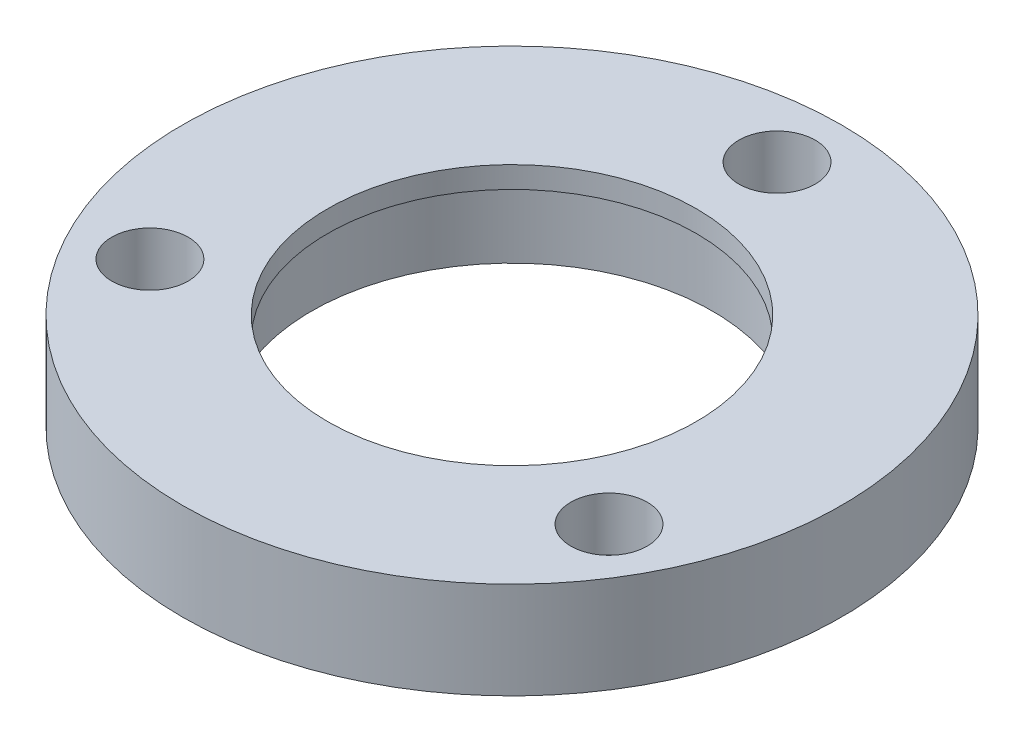
ISO-10303-21;
HEADER;
FILE_DESCRIPTION(('STEP AP214'),'2;1');
FILE_NAME('part.step','',(''),(''),'','','');
FILE_SCHEMA(('AUTOMOTIVE_DESIGN { 1 0 10303 214 1 1 1 1 }'));
ENDSEC;
DATA;
#1=APPLICATION_CONTEXT('core data for automotive mechanical design processes');
#2=APPLICATION_PROTOCOL_DEFINITION('international standard','automotive_design',2000,#1);
#3=PRODUCT_CONTEXT('',#1,'mechanical');
#4=PRODUCT('Part','Part','',(#3));
#5=PRODUCT_RELATED_PRODUCT_CATEGORY('part','',(#4));
#6=PRODUCT_DEFINITION_FORMATION('','',#4);
#7=PRODUCT_DEFINITION_CONTEXT('part definition',#1,'design');
#8=PRODUCT_DEFINITION('design','',#6,#7);
#9=PRODUCT_DEFINITION_SHAPE('','',#8);
#10=(LENGTH_UNIT() NAMED_UNIT(*) SI_UNIT(.MILLI.,.METRE.));
#11=(NAMED_UNIT(*) PLANE_ANGLE_UNIT() SI_UNIT($,.RADIAN.));
#12=(NAMED_UNIT(*) SI_UNIT($,.STERADIAN.) SOLID_ANGLE_UNIT());
#13=UNCERTAINTY_MEASURE_WITH_UNIT(LENGTH_MEASURE(1.E-05),#10,'distance_accuracy_value','');
#14=(GEOMETRIC_REPRESENTATION_CONTEXT(3) GLOBAL_UNCERTAINTY_ASSIGNED_CONTEXT((#13)) GLOBAL_UNIT_ASSIGNED_CONTEXT((#10,
#11,#12)) REPRESENTATION_CONTEXT('',''));
#15=CARTESIAN_POINT('',(0.,0.,0.));
#16=DIRECTION('',(0.,0.,1.));
#17=DIRECTION('',(1.,0.,0.));
#18=AXIS2_PLACEMENT_3D('',#15,#16,#17);
#19=CARTESIAN_POINT('',(21.3475262032864,0.,12.325));
#20=DIRECTION('',(0.,1.,0.));
#21=DIRECTION('',(0.,0.,1.));
#22=AXIS2_PLACEMENT_3D('',#19,#20,#21);
#23=CYLINDRICAL_SURFACE('',#22,2.25000000000012);
#24=CARTESIAN_POINT('',(21.3475262032864,0.,12.325));
#25=DIRECTION('',(0.,1.,0.));
#26=DIRECTION('',(0.,0.,1.));
#27=AXIS2_PLACEMENT_3D('',#24,#25,#26);
#28=CIRCLE('',#27,2.25000000000012);
#29=CARTESIAN_POINT('',(21.3475262032864,0.,14.5750000000001));
#30=VERTEX_POINT('',#29);
#31=EDGE_CURVE('E59',#30,#30,#28,.T.);
#32=ORIENTED_EDGE('',*,*,#31,.F.);
#33=EDGE_LOOP('',(#32));
#34=FACE_BOUND('',#33,.T.);
#35=CARTESIAN_POINT('',(21.3475262032864,4.,12.325));
#36=DIRECTION('',(0.,1.,0.));
#37=DIRECTION('',(0.,0.,1.));
#38=AXIS2_PLACEMENT_3D('',#35,#36,#37);
#39=CIRCLE('',#38,2.25000000000012);
#40=CARTESIAN_POINT('',(21.3475262032864,4.,14.5750000000001));
#41=VERTEX_POINT('',#40);
#42=EDGE_CURVE('E80',#41,#41,#39,.T.);
#43=ORIENTED_EDGE('',*,*,#42,.T.);
#44=EDGE_LOOP('',(#43));
#45=FACE_BOUND('',#44,.T.);
#46=ADVANCED_FACE('F32',(#34,#45),#23,.F.);
#47=CARTESIAN_POINT('',(-21.3475262032864,0.,12.325));
#48=DIRECTION('',(0.,1.,0.));
#49=DIRECTION('',(0.,0.,1.));
#50=AXIS2_PLACEMENT_3D('',#47,#48,#49);
#51=CYLINDRICAL_SURFACE('',#50,2.25000000000024);
#52=CARTESIAN_POINT('',(-21.3475262032864,0.,12.325));
#53=DIRECTION('',(0.,1.,0.));
#54=DIRECTION('',(0.,0.,1.));
#55=AXIS2_PLACEMENT_3D('',#52,#53,#54);
#56=CIRCLE('',#55,2.25000000000024);
#57=CARTESIAN_POINT('',(-21.3475262032864,0.,14.5750000000003));
#58=VERTEX_POINT('',#57);
#59=EDGE_CURVE('E62',#58,#58,#56,.T.);
#60=ORIENTED_EDGE('',*,*,#59,.F.);
#61=EDGE_LOOP('',(#60));
#62=FACE_BOUND('',#61,.T.);
#63=CARTESIAN_POINT('',(-21.3475262032864,4.,12.325));
#64=DIRECTION('',(0.,1.,0.));
#65=DIRECTION('',(0.,0.,1.));
#66=AXIS2_PLACEMENT_3D('',#63,#64,#65);
#67=CIRCLE('',#66,2.25000000000024);
#68=CARTESIAN_POINT('',(-21.3475262032864,4.,14.5750000000003));
#69=VERTEX_POINT('',#68);
#70=EDGE_CURVE('E71',#69,#69,#67,.T.);
#71=ORIENTED_EDGE('',*,*,#70,.T.);
#72=EDGE_LOOP('',(#71));
#73=FACE_BOUND('',#72,.T.);
#74=ADVANCED_FACE('F130',(#62,#73),#51,.F.);
#75=CARTESIAN_POINT('',(0.,0.,-24.65));
#76=DIRECTION('',(0.,1.,0.));
#77=DIRECTION('',(0.,0.,1.));
#78=AXIS2_PLACEMENT_3D('',#75,#76,#77);
#79=CYLINDRICAL_SURFACE('',#78,2.25);
#80=CARTESIAN_POINT('',(0.,0.,-24.65));
#81=DIRECTION('',(0.,1.,0.));
#82=DIRECTION('',(0.,0.,1.));
#83=AXIS2_PLACEMENT_3D('',#80,#81,#82);
#84=CIRCLE('',#83,2.25);
#85=CARTESIAN_POINT('',(0.,0.,-22.4));
#86=VERTEX_POINT('',#85);
#87=EDGE_CURVE('E58',#86,#86,#84,.T.);
#88=ORIENTED_EDGE('',*,*,#87,.F.);
#89=EDGE_LOOP('',(#88));
#90=FACE_BOUND('',#89,.T.);
#91=CARTESIAN_POINT('',(0.,4.,-24.65));
#92=DIRECTION('',(0.,1.,0.));
#93=DIRECTION('',(0.,0.,1.));
#94=AXIS2_PLACEMENT_3D('',#91,#92,#93);
#95=CIRCLE('',#94,2.25);
#96=CARTESIAN_POINT('',(0.,4.,-22.4));
#97=VERTEX_POINT('',#96);
#98=EDGE_CURVE('E63',#97,#97,#95,.T.);
#99=ORIENTED_EDGE('',*,*,#98,.T.);
#100=EDGE_LOOP('',(#99));
#101=FACE_BOUND('',#100,.T.);
#102=ADVANCED_FACE('F136',(#90,#101),#79,.F.);
#103=CARTESIAN_POINT('',(0.,23.6626482213439,0.));
#104=DIRECTION('',(0.,1.,0.));
#105=DIRECTION('',(0.,0.,1.));
#106=AXIS2_PLACEMENT_3D('',#103,#104,#105);
#107=CYLINDRICAL_SURFACE('',#106,17.15);
#108=CARTESIAN_POINT('',(0.,7.,0.));
#109=DIRECTION('',(0.,1.,0.));
#110=DIRECTION('',(0.,0.,1.));
#111=AXIS2_PLACEMENT_3D('',#108,#109,#110);
#112=CIRCLE('',#111,17.15);
#113=CARTESIAN_POINT('',(0.,7.,17.15));
#114=VERTEX_POINT('',#113);
#115=EDGE_CURVE('E55',#114,#114,#112,.T.);
#116=ORIENTED_EDGE('',*,*,#115,.F.);
#117=EDGE_LOOP('',(#116));
#118=FACE_BOUND('',#117,.T.);
#119=CARTESIAN_POINT('',(0.,9.,0.));
#120=DIRECTION('',(0.,1.,0.));
#121=DIRECTION('',(0.,0.,1.));
#122=AXIS2_PLACEMENT_3D('',#119,#120,#121);
#123=CIRCLE('',#122,17.15);
#124=CARTESIAN_POINT('',(0.,9.,17.15));
#125=VERTEX_POINT('',#124);
#126=EDGE_CURVE('E10',#125,#125,#123,.T.);
#127=ORIENTED_EDGE('',*,*,#126,.T.);
#128=EDGE_LOOP('',(#127));
#129=FACE_BOUND('',#128,.T.);
#130=ADVANCED_FACE('F34',(#118,#129),#107,.F.);
#131=CARTESIAN_POINT('',(17.15,9.,0.));
#132=DIRECTION('',(0.,-1.,0.));
#133=DIRECTION('',(0.,0.,-1.));
#134=AXIS2_PLACEMENT_3D('',#131,#132,#133);
#135=PLANE('',#134);
#136=CARTESIAN_POINT('',(0.,9.,-24.65));
#137=DIRECTION('',(0.,1.,0.));
#138=DIRECTION('',(0.,0.,1.));
#139=AXIS2_PLACEMENT_3D('',#136,#137,#138);
#140=CIRCLE('',#139,3.55);
#141=CARTESIAN_POINT('',(0.,9.,-21.1));
#142=VERTEX_POINT('',#141);
#143=EDGE_CURVE('E84',#142,#142,#140,.T.);
#144=ORIENTED_EDGE('',*,*,#143,.F.);
#145=EDGE_LOOP('',(#144));
#146=FACE_BOUND('',#145,.T.);
#147=CARTESIAN_POINT('',(21.3475262032864,9.,12.325));
#148=DIRECTION('',(0.,1.,0.));
#149=DIRECTION('',(0.,0.,1.));
#150=AXIS2_PLACEMENT_3D('',#147,#148,#149);
#151=CIRCLE('',#150,3.55000000000012);
#152=CARTESIAN_POINT('',(21.3475262032864,9.,15.8750000000001));
#153=VERTEX_POINT('',#152);
#154=EDGE_CURVE('E75',#153,#153,#151,.T.);
#155=ORIENTED_EDGE('',*,*,#154,.F.);
#156=EDGE_LOOP('',(#155));
#157=FACE_BOUND('',#156,.T.);
#158=CARTESIAN_POINT('',(-21.3475262032864,9.,12.325));
#159=DIRECTION('',(0.,1.,0.));
#160=DIRECTION('',(0.,0.,1.));
#161=AXIS2_PLACEMENT_3D('',#158,#159,#160);
#162=CIRCLE('',#161,3.55000000000023);
#163=CARTESIAN_POINT('',(-21.3475262032864,9.,15.8750000000003));
#164=VERTEX_POINT('',#163);
#165=EDGE_CURVE('E68',#164,#164,#162,.T.);
#166=ORIENTED_EDGE('',*,*,#165,.F.);
#167=EDGE_LOOP('',(#166));
#168=FACE_BOUND('',#167,.T.);
#169=ORIENTED_EDGE('',*,*,#126,.F.);
#170=EDGE_LOOP('',(#169));
#171=FACE_BOUND('',#170,.T.);
#172=CARTESIAN_POINT('',(0.,9.,0.));
#173=DIRECTION('',(0.,1.,0.));
#174=DIRECTION('',(0.,0.,1.));
#175=AXIS2_PLACEMENT_3D('',#172,#173,#174);
#176=CIRCLE('',#175,30.65);
#177=CARTESIAN_POINT('',(0.,9.,30.65));
#178=VERTEX_POINT('',#177);
#179=EDGE_CURVE('E39',#178,#178,#176,.T.);
#180=ORIENTED_EDGE('',*,*,#179,.T.);
#181=EDGE_LOOP('',(#180));
#182=FACE_BOUND('',#181,.T.);
#183=ADVANCED_FACE('F105',(#146,#157,#168,#171,#182),#135,.F.);
#184=CARTESIAN_POINT('',(0.,23.6626482213439,0.));
#185=DIRECTION('',(0.,1.,0.));
#186=DIRECTION('',(0.,0.,1.));
#187=AXIS2_PLACEMENT_3D('',#184,#185,#186);
#188=CYLINDRICAL_SURFACE('',#187,30.65);
#189=ORIENTED_EDGE('',*,*,#179,.F.);
#190=EDGE_LOOP('',(#189));
#191=FACE_BOUND('',#190,.T.);
#192=CARTESIAN_POINT('',(0.,0.,0.));
#193=DIRECTION('',(0.,1.,0.));
#194=DIRECTION('',(0.,0.,1.));
#195=AXIS2_PLACEMENT_3D('',#192,#193,#194);
#196=CIRCLE('',#195,30.65);
#197=CARTESIAN_POINT('',(0.,0.,30.65));
#198=VERTEX_POINT('',#197);
#199=EDGE_CURVE('E43',#198,#198,#196,.T.);
#200=ORIENTED_EDGE('',*,*,#199,.T.);
#201=EDGE_LOOP('',(#200));
#202=FACE_BOUND('',#201,.T.);
#203=ADVANCED_FACE('F108',(#191,#202),#188,.T.);
#204=CARTESIAN_POINT('',(30.65,0.,0.));
#205=DIRECTION('',(0.,1.,0.));
#206=DIRECTION('',(0.,0.,1.));
#207=AXIS2_PLACEMENT_3D('',#204,#205,#206);
#208=PLANE('',#207);
#209=ORIENTED_EDGE('',*,*,#87,.T.);
#210=EDGE_LOOP('',(#209));
#211=FACE_BOUND('',#210,.T.);
#212=ORIENTED_EDGE('',*,*,#59,.T.);
#213=EDGE_LOOP('',(#212));
#214=FACE_BOUND('',#213,.T.);
#215=ORIENTED_EDGE('',*,*,#31,.T.);
#216=EDGE_LOOP('',(#215));
#217=FACE_BOUND('',#216,.T.);
#218=ORIENTED_EDGE('',*,*,#199,.F.);
#219=EDGE_LOOP('',(#218));
#220=FACE_BOUND('',#219,.T.);
#221=CARTESIAN_POINT('',(0.,0.,0.));
#222=DIRECTION('',(0.,1.,0.));
#223=DIRECTION('',(0.,0.,1.));
#224=AXIS2_PLACEMENT_3D('',#221,#222,#223);
#225=CIRCLE('',#224,18.65);
#226=CARTESIAN_POINT('',(0.,0.,18.65));
#227=VERTEX_POINT('',#226);
#228=EDGE_CURVE('E47',#227,#227,#225,.T.);
#229=ORIENTED_EDGE('',*,*,#228,.T.);
#230=EDGE_LOOP('',(#229));
#231=FACE_BOUND('',#230,.T.);
#232=ADVANCED_FACE('F148',(#211,#214,#217,#220,#231),#208,.F.);
#233=CARTESIAN_POINT('',(0.,23.6626482213439,0.));
#234=DIRECTION('',(0.,1.,0.));
#235=DIRECTION('',(0.,0.,1.));
#236=AXIS2_PLACEMENT_3D('',#233,#234,#235);
#237=CYLINDRICAL_SURFACE('',#236,18.65);
#238=ORIENTED_EDGE('',*,*,#228,.F.);
#239=EDGE_LOOP('',(#238));
#240=FACE_BOUND('',#239,.T.);
#241=CARTESIAN_POINT('',(0.,7.,0.));
#242=DIRECTION('',(0.,1.,0.));
#243=DIRECTION('',(0.,0.,1.));
#244=AXIS2_PLACEMENT_3D('',#241,#242,#243);
#245=CIRCLE('',#244,18.65);
#246=CARTESIAN_POINT('',(0.,7.,18.65));
#247=VERTEX_POINT('',#246);
#248=EDGE_CURVE('E52',#247,#247,#245,.T.);
#249=ORIENTED_EDGE('',*,*,#248,.T.);
#250=EDGE_LOOP('',(#249));
#251=FACE_BOUND('',#250,.T.);
#252=ADVANCED_FACE('F144',(#240,#251),#237,.F.);
#253=CARTESIAN_POINT('',(18.65,7.,0.));
#254=DIRECTION('',(0.,1.,0.));
#255=DIRECTION('',(0.,0.,1.));
#256=AXIS2_PLACEMENT_3D('',#253,#254,#255);
#257=PLANE('',#256);
#258=ORIENTED_EDGE('',*,*,#248,.F.);
#259=EDGE_LOOP('',(#258));
#260=FACE_BOUND('',#259,.T.);
#261=ORIENTED_EDGE('',*,*,#115,.T.);
#262=EDGE_LOOP('',(#261));
#263=FACE_BOUND('',#262,.T.);
#264=ADVANCED_FACE('F101',(#260,#263),#257,.F.);
#265=CARTESIAN_POINT('',(0.,4.,-24.65));
#266=DIRECTION('',(0.,1.,0.));
#267=DIRECTION('',(0.,0.,1.));
#268=AXIS2_PLACEMENT_3D('',#265,#266,#267);
#269=CYLINDRICAL_SURFACE('',#268,3.55);
#270=CARTESIAN_POINT('',(0.,4.,-24.65));
#271=DIRECTION('',(0.,1.,0.));
#272=DIRECTION('',(0.,0.,1.));
#273=AXIS2_PLACEMENT_3D('',#270,#271,#272);
#274=CIRCLE('',#273,3.55);
#275=CARTESIAN_POINT('',(0.,4.,-21.1));
#276=VERTEX_POINT('',#275);
#277=EDGE_CURVE('E89',#276,#276,#274,.T.);
#278=ORIENTED_EDGE('',*,*,#277,.F.);
#279=EDGE_LOOP('',(#278));
#280=FACE_BOUND('',#279,.T.);
#281=ORIENTED_EDGE('',*,*,#143,.T.);
#282=EDGE_LOOP('',(#281));
#283=FACE_BOUND('',#282,.T.);
#284=ADVANCED_FACE('F98',(#280,#283),#269,.F.);
#285=CARTESIAN_POINT('',(0.,4.,0.));
#286=DIRECTION('',(0.,1.,0.));
#287=DIRECTION('',(0.,0.,1.));
#288=AXIS2_PLACEMENT_3D('',#285,#286,#287);
#289=PLANE('',#288);
#290=ORIENTED_EDGE('',*,*,#277,.T.);
#291=EDGE_LOOP('',(#290));
#292=FACE_BOUND('',#291,.T.);
#293=ORIENTED_EDGE('',*,*,#98,.F.);
#294=EDGE_LOOP('',(#293));
#295=FACE_BOUND('',#294,.T.);
#296=ADVANCED_FACE('F95',(#292,#295),#289,.T.);
#297=CARTESIAN_POINT('',(-21.3475262032864,4.,12.325));
#298=DIRECTION('',(0.,1.,0.));
#299=DIRECTION('',(0.,0.,1.));
#300=AXIS2_PLACEMENT_3D('',#297,#298,#299);
#301=CYLINDRICAL_SURFACE('',#300,3.55000000000023);
#302=CARTESIAN_POINT('',(-21.3475262032864,4.,12.325));
#303=DIRECTION('',(0.,1.,0.));
#304=DIRECTION('',(0.,0.,1.));
#305=AXIS2_PLACEMENT_3D('',#302,#303,#304);
#306=CIRCLE('',#305,3.55000000000023);
#307=CARTESIAN_POINT('',(-21.3475262032864,4.,15.8750000000003));
#308=VERTEX_POINT('',#307);
#309=EDGE_CURVE('E72',#308,#308,#306,.T.);
#310=ORIENTED_EDGE('',*,*,#309,.F.);
#311=EDGE_LOOP('',(#310));
#312=FACE_BOUND('',#311,.T.);
#313=ORIENTED_EDGE('',*,*,#165,.T.);
#314=EDGE_LOOP('',(#313));
#315=FACE_BOUND('',#314,.T.);
#316=ADVANCED_FACE('F114',(#312,#315),#301,.F.);
#317=CARTESIAN_POINT('',(0.,4.,0.));
#318=DIRECTION('',(0.,1.,0.));
#319=DIRECTION('',(0.,0.,1.));
#320=AXIS2_PLACEMENT_3D('',#317,#318,#319);
#321=PLANE('',#320);
#322=ORIENTED_EDGE('',*,*,#70,.F.);
#323=EDGE_LOOP('',(#322));
#324=FACE_BOUND('',#323,.T.);
#325=ORIENTED_EDGE('',*,*,#309,.T.);
#326=EDGE_LOOP('',(#325));
#327=FACE_BOUND('',#326,.T.);
#328=ADVANCED_FACE('F116',(#324,#327),#321,.T.);
#329=CARTESIAN_POINT('',(21.3475262032864,4.,12.325));
#330=DIRECTION('',(0.,1.,0.));
#331=DIRECTION('',(0.,0.,1.));
#332=AXIS2_PLACEMENT_3D('',#329,#330,#331);
#333=CYLINDRICAL_SURFACE('',#332,3.55000000000012);
#334=CARTESIAN_POINT('',(21.3475262032864,4.,12.325));
#335=DIRECTION('',(0.,1.,0.));
#336=DIRECTION('',(0.,0.,1.));
#337=AXIS2_PLACEMENT_3D('',#334,#335,#336);
#338=CIRCLE('',#337,3.55000000000012);
#339=CARTESIAN_POINT('',(21.3475262032864,4.,15.8750000000001));
#340=VERTEX_POINT('',#339);
#341=EDGE_CURVE('E81',#340,#340,#338,.T.);
#342=ORIENTED_EDGE('',*,*,#341,.F.);
#343=EDGE_LOOP('',(#342));
#344=FACE_BOUND('',#343,.T.);
#345=ORIENTED_EDGE('',*,*,#154,.T.);
#346=EDGE_LOOP('',(#345));
#347=FACE_BOUND('',#346,.T.);
#348=ADVANCED_FACE('F123',(#344,#347),#333,.F.);
#349=CARTESIAN_POINT('',(0.,4.,0.));
#350=DIRECTION('',(0.,1.,0.));
#351=DIRECTION('',(0.,0.,1.));
#352=AXIS2_PLACEMENT_3D('',#349,#350,#351);
#353=PLANE('',#352);
#354=ORIENTED_EDGE('',*,*,#42,.F.);
#355=EDGE_LOOP('',(#354));
#356=FACE_BOUND('',#355,.T.);
#357=ORIENTED_EDGE('',*,*,#341,.T.);
#358=EDGE_LOOP('',(#357));
#359=FACE_BOUND('',#358,.T.);
#360=ADVANCED_FACE('F257',(#356,#359),#353,.T.);
#361=CLOSED_SHELL('',(#46,#74,#102,#130,#183,#203,#232,#252,#264,#284,#296,#316,#328,#348,#360));
#362=MANIFOLD_SOLID_BREP('B2',#361);
#363=ADVANCED_BREP_SHAPE_REPRESENTATION('',(#18,#362),#14);
#364=SHAPE_DEFINITION_REPRESENTATION(#9,#363);
ENDSEC;
END-ISO-10303-21;
